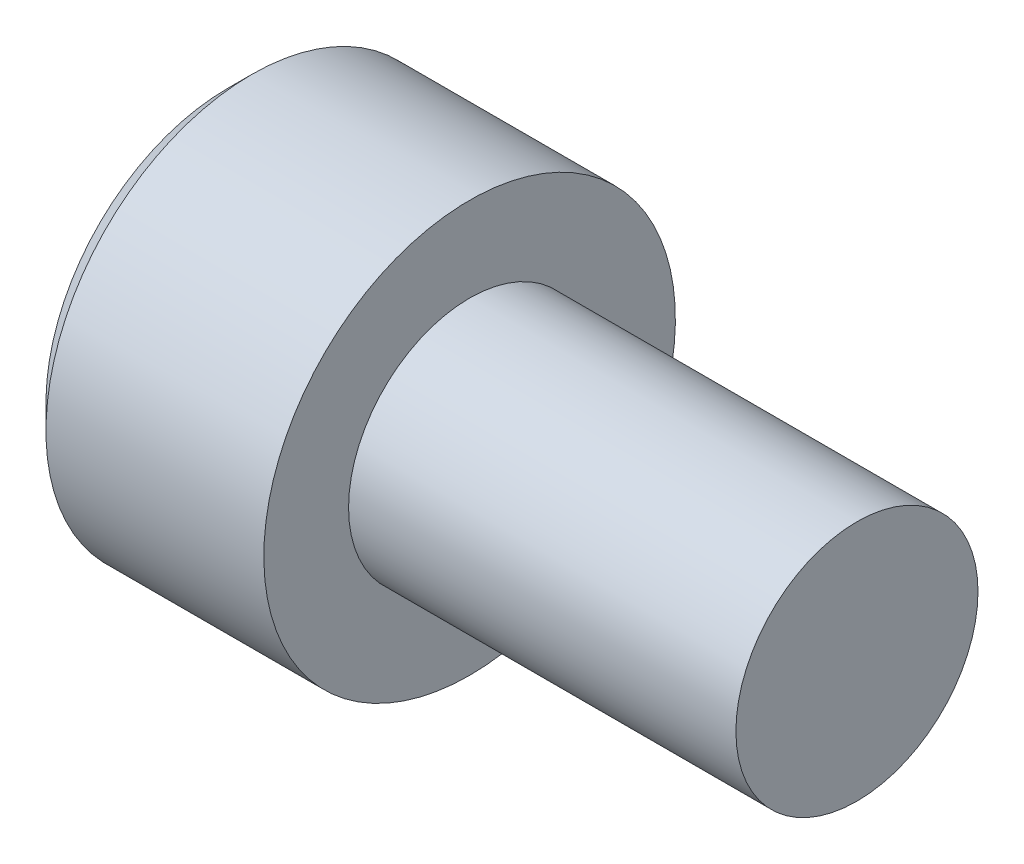
ISO-10303-21;
HEADER;
FILE_DESCRIPTION(('STEP AP214'),'2;1');
FILE_NAME('part.step','',(''),(''),'','','');
FILE_SCHEMA(('AUTOMOTIVE_DESIGN { 1 0 10303 214 1 1 1 1 }'));
ENDSEC;
DATA;
#1=APPLICATION_CONTEXT('core data for automotive mechanical design processes');
#2=APPLICATION_PROTOCOL_DEFINITION('international standard','automotive_design',2000,#1);
#3=PRODUCT_CONTEXT('',#1,'mechanical');
#4=PRODUCT('Part','Part','',(#3));
#5=PRODUCT_RELATED_PRODUCT_CATEGORY('part','',(#4));
#6=PRODUCT_DEFINITION_FORMATION('','',#4);
#7=PRODUCT_DEFINITION_CONTEXT('part definition',#1,'design');
#8=PRODUCT_DEFINITION('design','',#6,#7);
#9=PRODUCT_DEFINITION_SHAPE('','',#8);
#10=(LENGTH_UNIT() NAMED_UNIT(*) SI_UNIT(.MILLI.,.METRE.));
#11=(NAMED_UNIT(*) PLANE_ANGLE_UNIT() SI_UNIT($,.RADIAN.));
#12=(NAMED_UNIT(*) SI_UNIT($,.STERADIAN.) SOLID_ANGLE_UNIT());
#13=UNCERTAINTY_MEASURE_WITH_UNIT(LENGTH_MEASURE(1.E-05),#10,'distance_accuracy_value','');
#14=(GEOMETRIC_REPRESENTATION_CONTEXT(3) GLOBAL_UNCERTAINTY_ASSIGNED_CONTEXT((#13)) GLOBAL_UNIT_ASSIGNED_CONTEXT((#10,
#11,#12)) REPRESENTATION_CONTEXT('',''));
#15=CARTESIAN_POINT('',(0.,0.,0.));
#16=DIRECTION('',(0.,0.,1.));
#17=DIRECTION('',(1.,0.,0.));
#18=AXIS2_PLACEMENT_3D('',#15,#16,#17);
#19=CARTESIAN_POINT('',(-5.,0.,0.));
#20=DIRECTION('',(1.,0.,0.));
#21=DIRECTION('',(0.,1.,0.));
#22=AXIS2_PLACEMENT_3D('',#19,#20,#21);
#23=PLANE('',#22);
#24=CARTESIAN_POINT('',(-5.,0.,0.));
#25=DIRECTION('',(1.,0.,0.));
#26=DIRECTION('',(0.,1.,0.));
#27=AXIS2_PLACEMENT_3D('',#24,#25,#26);
#28=CIRCLE('',#27,3.75);
#29=CARTESIAN_POINT('',(-5.,3.75,0.));
#30=VERTEX_POINT('',#29);
#31=EDGE_CURVE('E44',#30,#30,#28,.F.);
#32=ORIENTED_EDGE('',*,*,#31,.T.);
#33=EDGE_LOOP('',(#32));
#34=FACE_BOUND('',#33,.T.);
#35=DIRECTION('',(0.,0.5,-0.866025403784438));
#36=VECTOR('',#35,1.);
#37=CARTESIAN_POINT('',(-5.,1.15470053837925,2.));
#38=LINE('',#37,#36);
#39=CARTESIAN_POINT('',(-5.,1.15470053837925,2.));
#40=VERTEX_POINT('',#39);
#41=CARTESIAN_POINT('',(-5.,2.3094010767585,0.));
#42=VERTEX_POINT('',#41);
#43=EDGE_CURVE('E149',#40,#42,#38,.T.);
#44=ORIENTED_EDGE('',*,*,#43,.F.);
#45=DIRECTION('',(0.,1.,0.));
#46=VECTOR('',#45,1.);
#47=CARTESIAN_POINT('',(-5.,-1.15470053837925,2.));
#48=LINE('',#47,#46);
#49=CARTESIAN_POINT('',(-5.,-1.15470053837925,2.));
#50=VERTEX_POINT('',#49);
#51=EDGE_CURVE('E122',#50,#40,#48,.T.);
#52=ORIENTED_EDGE('',*,*,#51,.F.);
#53=DIRECTION('',(0.,0.5,0.866025403784439));
#54=VECTOR('',#53,1.);
#55=CARTESIAN_POINT('',(-5.,-2.3094010767585,0.));
#56=LINE('',#55,#54);
#57=CARTESIAN_POINT('',(-5.,-2.3094010767585,0.));
#58=VERTEX_POINT('',#57);
#59=EDGE_CURVE('E118',#58,#50,#56,.T.);
#60=ORIENTED_EDGE('',*,*,#59,.F.);
#61=DIRECTION('',(0.,-0.5,0.866025403784439));
#62=VECTOR('',#61,1.);
#63=CARTESIAN_POINT('',(-5.,-1.15470053837925,-2.));
#64=LINE('',#63,#62);
#65=CARTESIAN_POINT('',(-5.,-1.15470053837925,-2.));
#66=VERTEX_POINT('',#65);
#67=EDGE_CURVE('E155',#66,#58,#64,.T.);
#68=ORIENTED_EDGE('',*,*,#67,.F.);
#69=DIRECTION('',(0.,-1.,0.));
#70=VECTOR('',#69,1.);
#71=CARTESIAN_POINT('',(-5.,1.15470053837925,-2.));
#72=LINE('',#71,#70);
#73=CARTESIAN_POINT('',(-5.,1.15470053837925,-2.));
#74=VERTEX_POINT('',#73);
#75=EDGE_CURVE('E153',#74,#66,#72,.T.);
#76=ORIENTED_EDGE('',*,*,#75,.F.);
#77=DIRECTION('',(0.,-0.5,-0.866025403784439));
#78=VECTOR('',#77,1.);
#79=CARTESIAN_POINT('',(-5.,2.3094010767585,0.));
#80=LINE('',#79,#78);
#81=EDGE_CURVE('E151',#42,#74,#80,.T.);
#82=ORIENTED_EDGE('',*,*,#81,.F.);
#83=EDGE_LOOP('',(#44,#52,#60,#68,#76,#82));
#84=FACE_BOUND('',#83,.T.);
#85=ADVANCED_FACE('F36',(#34,#84),#23,.F.);
#86=CARTESIAN_POINT('',(0.,2.5,0.));
#87=DIRECTION('',(-1.,0.,0.));
#88=DIRECTION('',(0.,-1.,0.));
#89=AXIS2_PLACEMENT_3D('',#86,#87,#88);
#90=PLANE('',#89);
#91=CARTESIAN_POINT('',(0.,0.,0.));
#92=DIRECTION('',(-1.,0.,0.));
#93=DIRECTION('',(0.,-1.,0.));
#94=AXIS2_PLACEMENT_3D('',#91,#92,#93);
#95=CIRCLE('',#94,4.25);
#96=CARTESIAN_POINT('',(0.,-4.25,0.));
#97=VERTEX_POINT('',#96);
#98=EDGE_CURVE('E181',#97,#97,#95,.T.);
#99=ORIENTED_EDGE('',*,*,#98,.F.);
#100=EDGE_LOOP('',(#99));
#101=FACE_BOUND('',#100,.T.);
#102=CARTESIAN_POINT('',(0.,0.,0.));
#103=DIRECTION('',(-1.,0.,0.));
#104=DIRECTION('',(0.,-1.,0.));
#105=AXIS2_PLACEMENT_3D('',#102,#103,#104);
#106=CIRCLE('',#105,2.5);
#107=CARTESIAN_POINT('',(0.,-2.5,0.));
#108=VERTEX_POINT('',#107);
#109=EDGE_CURVE('E175',#108,#108,#106,.T.);
#110=ORIENTED_EDGE('',*,*,#109,.T.);
#111=EDGE_LOOP('',(#110));
#112=FACE_BOUND('',#111,.T.);
#113=ADVANCED_FACE('F199',(#101,#112),#90,.F.);
#114=CARTESIAN_POINT('',(-5.,0.,0.));
#115=DIRECTION('',(-1.,0.,0.));
#116=DIRECTION('',(0.,-1.,0.));
#117=AXIS2_PLACEMENT_3D('',#114,#115,#116);
#118=CYLINDRICAL_SURFACE('',#117,4.25);
#119=CARTESIAN_POINT('',(-4.5,0.,0.));
#120=DIRECTION('',(1.,0.,0.));
#121=DIRECTION('',(0.,1.,0.));
#122=AXIS2_PLACEMENT_3D('',#119,#120,#121);
#123=CIRCLE('',#122,4.25);
#124=CARTESIAN_POINT('',(-4.5,4.25,0.));
#125=VERTEX_POINT('',#124);
#126=EDGE_CURVE('E11',#125,#125,#123,.T.);
#127=ORIENTED_EDGE('',*,*,#126,.T.);
#128=EDGE_LOOP('',(#127));
#129=FACE_BOUND('',#128,.T.);
#130=ORIENTED_EDGE('',*,*,#98,.T.);
#131=EDGE_LOOP('',(#130));
#132=FACE_BOUND('',#131,.T.);
#133=ADVANCED_FACE('F204',(#129,#132),#118,.T.);
#134=CARTESIAN_POINT('',(8.,2.5,0.));
#135=DIRECTION('',(-1.,0.,0.));
#136=DIRECTION('',(0.,-1.,0.));
#137=AXIS2_PLACEMENT_3D('',#134,#135,#136);
#138=PLANE('',#137);
#139=CARTESIAN_POINT('',(8.,0.,0.));
#140=DIRECTION('',(-1.,0.,0.));
#141=DIRECTION('',(0.,-1.,0.));
#142=AXIS2_PLACEMENT_3D('',#139,#140,#141);
#143=CIRCLE('',#142,2.5);
#144=CARTESIAN_POINT('',(8.,-2.5,0.));
#145=VERTEX_POINT('',#144);
#146=EDGE_CURVE('E178',#145,#145,#143,.T.);
#147=ORIENTED_EDGE('',*,*,#146,.F.);
#148=EDGE_LOOP('',(#147));
#149=FACE_BOUND('',#148,.T.);
#150=ADVANCED_FACE('F208',(#149),#138,.F.);
#151=CARTESIAN_POINT('',(-5.,0.,0.));
#152=DIRECTION('',(-1.,0.,0.));
#153=DIRECTION('',(0.,-1.,0.));
#154=AXIS2_PLACEMENT_3D('',#151,#152,#153);
#155=CYLINDRICAL_SURFACE('',#154,2.5);
#156=ORIENTED_EDGE('',*,*,#109,.F.);
#157=EDGE_LOOP('',(#156));
#158=FACE_BOUND('',#157,.T.);
#159=ORIENTED_EDGE('',*,*,#146,.T.);
#160=EDGE_LOOP('',(#159));
#161=FACE_BOUND('',#160,.T.);
#162=ADVANCED_FACE('F215',(#158,#161),#155,.T.);
#163=CARTESIAN_POINT('',(-2.5,-1.15470053837925,2.));
#164=DIRECTION('',(0.,0.,1.));
#165=DIRECTION('',(0.,-1.,0.));
#166=AXIS2_PLACEMENT_3D('',#163,#164,#165);
#167=PLANE('',#166);
#168=DIRECTION('',(0.,1.,0.));
#169=VECTOR('',#168,1.);
#170=CARTESIAN_POINT('',(-2.5,-1.15470053837925,2.));
#171=LINE('',#170,#169);
#172=CARTESIAN_POINT('',(-2.5,-1.15470053837925,2.));
#173=VERTEX_POINT('',#172);
#174=CARTESIAN_POINT('',(-2.5,0.,2.));
#175=VERTEX_POINT('',#174);
#176=EDGE_CURVE('E59',#173,#175,#171,.T.);
#177=ORIENTED_EDGE('',*,*,#176,.F.);
#178=DIRECTION('',(-1.,0.,0.));
#179=VECTOR('',#178,1.);
#180=CARTESIAN_POINT('',(-2.5,-1.15470053837925,2.));
#181=LINE('',#180,#179);
#182=EDGE_CURVE('E159',#173,#50,#181,.T.);
#183=ORIENTED_EDGE('',*,*,#182,.T.);
#184=ORIENTED_EDGE('',*,*,#51,.T.);
#185=DIRECTION('',(-1.,0.,0.));
#186=VECTOR('',#185,1.);
#187=CARTESIAN_POINT('',(-2.5,1.15470053837925,2.));
#188=LINE('',#187,#186);
#189=CARTESIAN_POINT('',(-2.5,1.15470053837925,2.));
#190=VERTEX_POINT('',#189);
#191=EDGE_CURVE('E51',#190,#40,#188,.T.);
#192=ORIENTED_EDGE('',*,*,#191,.F.);
#193=EDGE_CURVE('E111',#175,#190,#171,.T.);
#194=ORIENTED_EDGE('',*,*,#193,.F.);
#195=EDGE_LOOP('',(#177,#183,#184,#192,#194));
#196=FACE_BOUND('',#195,.T.);
#197=ADVANCED_FACE('F120',(#196),#167,.F.);
#198=CARTESIAN_POINT('',(-2.5,-2.3094010767585,0.));
#199=DIRECTION('',(0.,-0.866025403784439,0.5));
#200=DIRECTION('',(0.,-0.5,-0.866025403784439));
#201=AXIS2_PLACEMENT_3D('',#198,#199,#200);
#202=PLANE('',#201);
#203=DIRECTION('',(0.,0.5,0.866025403784439));
#204=VECTOR('',#203,1.);
#205=CARTESIAN_POINT('',(-2.5,-2.3094010767585,0.));
#206=LINE('',#205,#204);
#207=CARTESIAN_POINT('',(-2.5,-2.3094010767585,0.));
#208=VERTEX_POINT('',#207);
#209=CARTESIAN_POINT('',(-2.5,-1.73205080756888,1.));
#210=VERTEX_POINT('',#209);
#211=EDGE_CURVE('E125',#208,#210,#206,.T.);
#212=ORIENTED_EDGE('',*,*,#211,.F.);
#213=DIRECTION('',(-1.,0.,0.));
#214=VECTOR('',#213,1.);
#215=CARTESIAN_POINT('',(-2.5,-2.3094010767585,0.));
#216=LINE('',#215,#214);
#217=EDGE_CURVE('E162',#208,#58,#216,.T.);
#218=ORIENTED_EDGE('',*,*,#217,.T.);
#219=ORIENTED_EDGE('',*,*,#59,.T.);
#220=ORIENTED_EDGE('',*,*,#182,.F.);
#221=EDGE_CURVE('E145',#210,#173,#206,.T.);
#222=ORIENTED_EDGE('',*,*,#221,.F.);
#223=EDGE_LOOP('',(#212,#218,#219,#220,#222));
#224=FACE_BOUND('',#223,.T.);
#225=ADVANCED_FACE('F228',(#224),#202,.F.);
#226=CARTESIAN_POINT('',(-2.5,-1.15470053837925,-2.));
#227=DIRECTION('',(0.,-0.866025403784439,-0.5));
#228=DIRECTION('',(0.,0.5,-0.866025403784439));
#229=AXIS2_PLACEMENT_3D('',#226,#227,#228);
#230=PLANE('',#229);
#231=DIRECTION('',(0.,-0.5,0.866025403784439));
#232=VECTOR('',#231,1.);
#233=CARTESIAN_POINT('',(-2.5,-1.15470053837925,-2.));
#234=LINE('',#233,#232);
#235=CARTESIAN_POINT('',(-2.5,-1.15470053837925,-2.));
#236=VERTEX_POINT('',#235);
#237=CARTESIAN_POINT('',(-2.5,-1.73205080756888,-1.));
#238=VERTEX_POINT('',#237);
#239=EDGE_CURVE('E142',#236,#238,#234,.T.);
#240=ORIENTED_EDGE('',*,*,#239,.F.);
#241=DIRECTION('',(-1.,0.,0.));
#242=VECTOR('',#241,1.);
#243=CARTESIAN_POINT('',(-2.5,-1.15470053837925,-2.));
#244=LINE('',#243,#242);
#245=EDGE_CURVE('E165',#236,#66,#244,.T.);
#246=ORIENTED_EDGE('',*,*,#245,.T.);
#247=ORIENTED_EDGE('',*,*,#67,.T.);
#248=ORIENTED_EDGE('',*,*,#217,.F.);
#249=EDGE_CURVE('E141',#238,#208,#234,.T.);
#250=ORIENTED_EDGE('',*,*,#249,.F.);
#251=EDGE_LOOP('',(#240,#246,#247,#248,#250));
#252=FACE_BOUND('',#251,.T.);
#253=ADVANCED_FACE('F240',(#252),#230,.F.);
#254=CARTESIAN_POINT('',(-2.5,1.15470053837925,-2.));
#255=DIRECTION('',(0.,0.,-1.));
#256=DIRECTION('',(-1.,0.,0.));
#257=AXIS2_PLACEMENT_3D('',#254,#255,#256);
#258=PLANE('',#257);
#259=DIRECTION('',(0.,-1.,0.));
#260=VECTOR('',#259,1.);
#261=CARTESIAN_POINT('',(-2.5,1.15470053837925,-2.));
#262=LINE('',#261,#260);
#263=CARTESIAN_POINT('',(-2.5,1.15470053837925,-2.));
#264=VERTEX_POINT('',#263);
#265=CARTESIAN_POINT('',(-2.5,0.,-2.));
#266=VERTEX_POINT('',#265);
#267=EDGE_CURVE('E138',#264,#266,#262,.T.);
#268=ORIENTED_EDGE('',*,*,#267,.F.);
#269=DIRECTION('',(-1.,0.,0.));
#270=VECTOR('',#269,1.);
#271=CARTESIAN_POINT('',(-2.5,1.15470053837925,-2.));
#272=LINE('',#271,#270);
#273=EDGE_CURVE('E168',#264,#74,#272,.T.);
#274=ORIENTED_EDGE('',*,*,#273,.T.);
#275=ORIENTED_EDGE('',*,*,#75,.T.);
#276=ORIENTED_EDGE('',*,*,#245,.F.);
#277=EDGE_CURVE('E137',#266,#236,#262,.T.);
#278=ORIENTED_EDGE('',*,*,#277,.F.);
#279=EDGE_LOOP('',(#268,#274,#275,#276,#278));
#280=FACE_BOUND('',#279,.T.);
#281=ADVANCED_FACE('F236',(#280),#258,.F.);
#282=CARTESIAN_POINT('',(-2.5,2.3094010767585,0.));
#283=DIRECTION('',(0.,0.866025403784439,-0.5));
#284=DIRECTION('',(0.,0.5,0.866025403784439));
#285=AXIS2_PLACEMENT_3D('',#282,#283,#284);
#286=PLANE('',#285);
#287=DIRECTION('',(0.,-0.5,-0.866025403784439));
#288=VECTOR('',#287,1.);
#289=CARTESIAN_POINT('',(-2.5,2.3094010767585,0.));
#290=LINE('',#289,#288);
#291=CARTESIAN_POINT('',(-2.5,2.3094010767585,0.));
#292=VERTEX_POINT('',#291);
#293=CARTESIAN_POINT('',(-2.5,1.73205080756888,-0.999999999999999));
#294=VERTEX_POINT('',#293);
#295=EDGE_CURVE('E133',#292,#294,#290,.T.);
#296=ORIENTED_EDGE('',*,*,#295,.F.);
#297=DIRECTION('',(-1.,0.,0.));
#298=VECTOR('',#297,1.);
#299=CARTESIAN_POINT('',(-2.5,2.3094010767585,0.));
#300=LINE('',#299,#298);
#301=EDGE_CURVE('E124',#292,#42,#300,.T.);
#302=ORIENTED_EDGE('',*,*,#301,.T.);
#303=ORIENTED_EDGE('',*,*,#81,.T.);
#304=ORIENTED_EDGE('',*,*,#273,.F.);
#305=EDGE_CURVE('E131',#294,#264,#290,.T.);
#306=ORIENTED_EDGE('',*,*,#305,.F.);
#307=EDGE_LOOP('',(#296,#302,#303,#304,#306));
#308=FACE_BOUND('',#307,.T.);
#309=ADVANCED_FACE('F233',(#308),#286,.F.);
#310=CARTESIAN_POINT('',(-2.5,1.15470053837925,2.));
#311=DIRECTION('',(0.,0.866025403784439,0.5));
#312=DIRECTION('',(0.,-0.5,0.866025403784439));
#313=AXIS2_PLACEMENT_3D('',#310,#311,#312);
#314=PLANE('',#313);
#315=DIRECTION('',(0.,0.5,-0.866025403784438));
#316=VECTOR('',#315,1.);
#317=CARTESIAN_POINT('',(-2.5,1.15470053837925,2.));
#318=LINE('',#317,#316);
#319=CARTESIAN_POINT('',(-2.5,1.73205080756888,1.));
#320=VERTEX_POINT('',#319);
#321=EDGE_CURVE('E113',#190,#320,#318,.T.);
#322=ORIENTED_EDGE('',*,*,#321,.F.);
#323=ORIENTED_EDGE('',*,*,#191,.T.);
#324=ORIENTED_EDGE('',*,*,#43,.T.);
#325=ORIENTED_EDGE('',*,*,#301,.F.);
#326=EDGE_CURVE('E130',#320,#292,#318,.T.);
#327=ORIENTED_EDGE('',*,*,#326,.F.);
#328=EDGE_LOOP('',(#322,#323,#324,#325,#327));
#329=FACE_BOUND('',#328,.T.);
#330=ADVANCED_FACE('F128',(#329),#314,.F.);
#331=CARTESIAN_POINT('',(-2.5,0.,0.));
#332=DIRECTION('',(-1.,0.,0.));
#333=DIRECTION('',(0.,0.,1.));
#334=AXIS2_PLACEMENT_3D('',#331,#332,#333);
#335=PLANE('',#334);
#336=ORIENTED_EDGE('',*,*,#193,.T.);
#337=ORIENTED_EDGE('',*,*,#321,.T.);
#338=CARTESIAN_POINT('',(-2.5,0.,0.));
#339=DIRECTION('',(-1.,0.,0.));
#340=DIRECTION('',(0.,-1.,0.));
#341=AXIS2_PLACEMENT_3D('',#338,#339,#340);
#342=CIRCLE('',#341,2.);
#343=EDGE_CURVE('E115',#175,#320,#342,.T.);
#344=ORIENTED_EDGE('',*,*,#343,.F.);
#345=EDGE_LOOP('',(#336,#337,#344));
#346=FACE_BOUND('',#345,.T.);
#347=ADVANCED_FACE('F112',(#346),#335,.T.);
#348=ORIENTED_EDGE('',*,*,#326,.T.);
#349=ORIENTED_EDGE('',*,*,#295,.T.);
#350=EDGE_CURVE('E268',#320,#294,#342,.T.);
#351=ORIENTED_EDGE('',*,*,#350,.F.);
#352=EDGE_LOOP('',(#348,#349,#351));
#353=FACE_BOUND('',#352,.T.);
#354=ADVANCED_FACE('F256',(#353),#335,.T.);
#355=ORIENTED_EDGE('',*,*,#305,.T.);
#356=ORIENTED_EDGE('',*,*,#267,.T.);
#357=EDGE_CURVE('E274',#294,#266,#342,.T.);
#358=ORIENTED_EDGE('',*,*,#357,.F.);
#359=EDGE_LOOP('',(#355,#356,#358));
#360=FACE_BOUND('',#359,.T.);
#361=ADVANCED_FACE('F260',(#360),#335,.T.);
#362=ORIENTED_EDGE('',*,*,#277,.T.);
#363=ORIENTED_EDGE('',*,*,#239,.T.);
#364=EDGE_CURVE('E276',#266,#238,#342,.T.);
#365=ORIENTED_EDGE('',*,*,#364,.F.);
#366=EDGE_LOOP('',(#362,#363,#365));
#367=FACE_BOUND('',#366,.T.);
#368=ADVANCED_FACE('F253',(#367),#335,.T.);
#369=ORIENTED_EDGE('',*,*,#249,.T.);
#370=ORIENTED_EDGE('',*,*,#211,.T.);
#371=EDGE_CURVE('E161',#238,#210,#342,.T.);
#372=ORIENTED_EDGE('',*,*,#371,.F.);
#373=EDGE_LOOP('',(#369,#370,#372));
#374=FACE_BOUND('',#373,.T.);
#375=ADVANCED_FACE('F249',(#374),#335,.T.);
#376=ORIENTED_EDGE('',*,*,#221,.T.);
#377=ORIENTED_EDGE('',*,*,#176,.T.);
#378=EDGE_CURVE('E173',#210,#175,#342,.T.);
#379=ORIENTED_EDGE('',*,*,#378,.F.);
#380=EDGE_LOOP('',(#376,#377,#379));
#381=FACE_BOUND('',#380,.T.);
#382=ADVANCED_FACE('F194',(#381),#335,.T.);
#383=CARTESIAN_POINT('',(-1.29827876194487,0.,0.));
#384=DIRECTION('',(-1.,0.,0.));
#385=DIRECTION('',(0.,-1.,0.));
#386=AXIS2_PLACEMENT_3D('',#383,#384,#385);
#387=CONICAL_SURFACE('',#386,0.,1.02974425867665);
#388=ORIENTED_EDGE('',*,*,#378,.T.);
#389=ORIENTED_EDGE('',*,*,#343,.T.);
#390=ORIENTED_EDGE('',*,*,#350,.T.);
#391=ORIENTED_EDGE('',*,*,#357,.T.);
#392=ORIENTED_EDGE('',*,*,#364,.T.);
#393=ORIENTED_EDGE('',*,*,#371,.T.);
#394=EDGE_LOOP('',(#388,#389,#390,#391,#392,#393));
#395=FACE_BOUND('',#394,.T.);
#396=CARTESIAN_POINT('',(-1.29827876194487,0.,0.));
#397=VERTEX_POINT('',#396);
#398=VERTEX_LOOP('',#397);
#399=FACE_BOUND('',#398,.T.);
#400=ADVANCED_FACE('F189',(#395,#399),#387,.F.);
#401=CARTESIAN_POINT('',(-5.,0.,0.));
#402=DIRECTION('',(1.,0.,0.));
#403=DIRECTION('',(0.,1.,0.));
#404=AXIS2_PLACEMENT_3D('',#401,#402,#403);
#405=CONICAL_SURFACE('',#404,3.75,0.785398163397447);
#406=ORIENTED_EDGE('',*,*,#126,.F.);
#407=EDGE_LOOP('',(#406));
#408=FACE_BOUND('',#407,.T.);
#409=ORIENTED_EDGE('',*,*,#31,.F.);
#410=EDGE_LOOP('',(#409));
#411=FACE_BOUND('',#410,.T.);
#412=ADVANCED_FACE('F38',(#408,#411),#405,.T.);
#413=CLOSED_SHELL('',(#85,#113,#133,#150,#162,#197,#225,#253,#281,#309,#330,#347,#354,#361,#368,
#375,#382,#400,#412));
#414=MANIFOLD_SOLID_BREP('B2',#413);
#415=ADVANCED_BREP_SHAPE_REPRESENTATION('',(#18,#414),#14);
#416=SHAPE_DEFINITION_REPRESENTATION(#9,#415);
ENDSEC;
END-ISO-10303-21;
